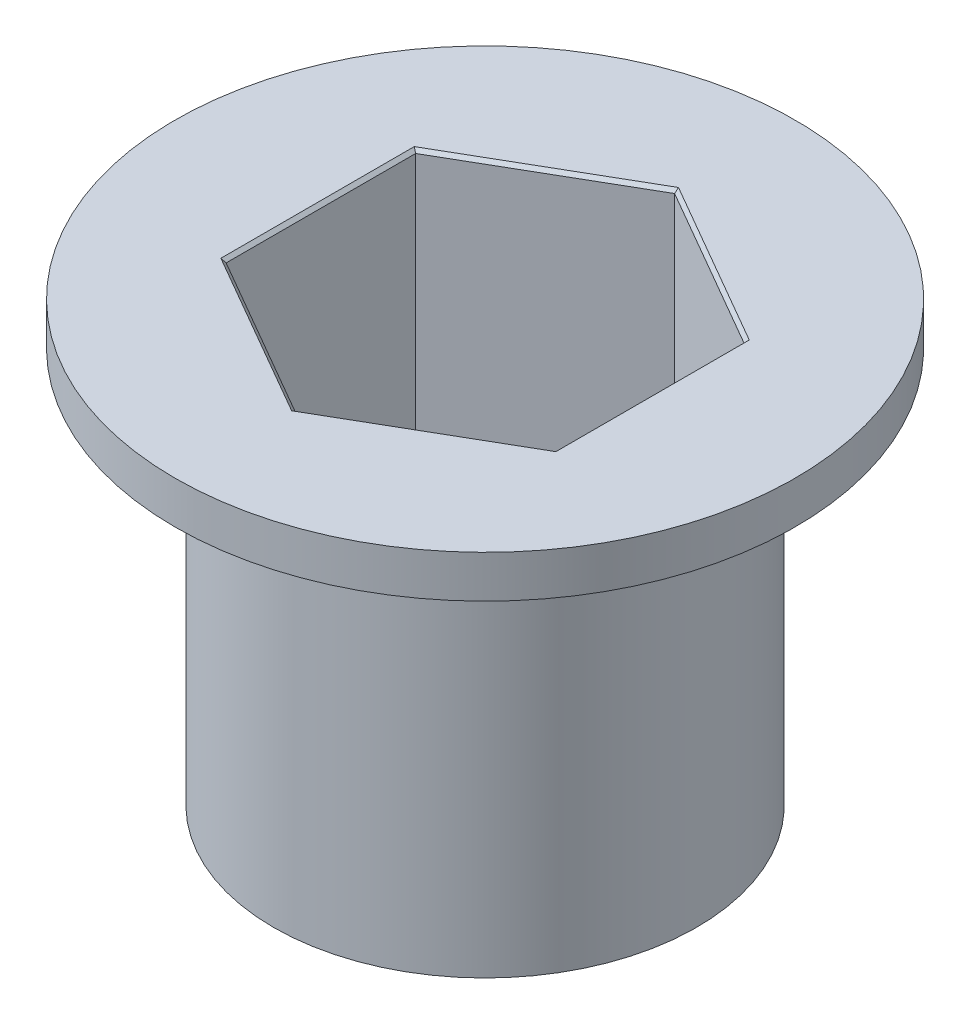
ISO-10303-21;
HEADER;
FILE_DESCRIPTION(('STEP AP214'),'2;1');
FILE_NAME('part.step','',(''),(''),'','','');
FILE_SCHEMA(('AUTOMOTIVE_DESIGN { 1 0 10303 214 1 1 1 1 }'));
ENDSEC;
DATA;
#1=APPLICATION_CONTEXT('core data for automotive mechanical design processes');
#2=APPLICATION_PROTOCOL_DEFINITION('international standard','automotive_design',2000,#1);
#3=PRODUCT_CONTEXT('',#1,'mechanical');
#4=PRODUCT('Part','Part','',(#3));
#5=PRODUCT_RELATED_PRODUCT_CATEGORY('part','',(#4));
#6=PRODUCT_DEFINITION_FORMATION('','',#4);
#7=PRODUCT_DEFINITION_CONTEXT('part definition',#1,'design');
#8=PRODUCT_DEFINITION('design','',#6,#7);
#9=PRODUCT_DEFINITION_SHAPE('','',#8);
#10=(LENGTH_UNIT() NAMED_UNIT(*) SI_UNIT(.MILLI.,.METRE.));
#11=(NAMED_UNIT(*) PLANE_ANGLE_UNIT() SI_UNIT($,.RADIAN.));
#12=(NAMED_UNIT(*) SI_UNIT($,.STERADIAN.) SOLID_ANGLE_UNIT());
#13=UNCERTAINTY_MEASURE_WITH_UNIT(LENGTH_MEASURE(1.E-05),#10,'distance_accuracy_value','');
#14=(GEOMETRIC_REPRESENTATION_CONTEXT(3) GLOBAL_UNCERTAINTY_ASSIGNED_CONTEXT((#13)) GLOBAL_UNIT_ASSIGNED_CONTEXT((#10,
#11,#12)) REPRESENTATION_CONTEXT('',''));
#15=CARTESIAN_POINT('',(0.,0.,0.));
#16=DIRECTION('',(0.,0.,1.));
#17=DIRECTION('',(1.,0.,0.));
#18=AXIS2_PLACEMENT_3D('',#15,#16,#17);
#19=CARTESIAN_POINT('',(0.,0.,0.));
#20=DIRECTION('',(0.,1.,0.));
#21=DIRECTION('',(0.,0.,1.));
#22=AXIS2_PLACEMENT_3D('',#19,#20,#21);
#23=PLANE('',#22);
#24=DIRECTION('',(-0.866025403784439,0.,-0.5));
#25=VECTOR('',#24,1.);
#26=CARTESIAN_POINT('',(0.0499999999999953,0.,-5.77638942130289));
#27=LINE('',#26,#25);
#28=CARTESIAN_POINT('',(5.02749998099999,0.,-2.90262846738119));
#29=VERTEX_POINT('',#28);
#30=CARTESIAN_POINT('',(0.,0.,-5.80525693476237));
#31=VERTEX_POINT('',#30);
#32=EDGE_CURVE('E225',#29,#31,#27,.T.);
#33=ORIENTED_EDGE('',*,*,#32,.T.);
#34=DIRECTION('',(-0.866025403784439,0.,0.5));
#35=VECTOR('',#34,1.);
#36=CARTESIAN_POINT('',(-4.977499981,0.,-2.93149598084066));
#37=LINE('',#36,#35);
#38=CARTESIAN_POINT('',(-5.02749998099999,0.,-2.90262846738118));
#39=VERTEX_POINT('',#38);
#40=EDGE_CURVE('E129',#31,#39,#37,.T.);
#41=ORIENTED_EDGE('',*,*,#40,.T.);
#42=DIRECTION('',(0.,0.,1.));
#43=VECTOR('',#42,1.);
#44=CARTESIAN_POINT('',(-5.02749998099999,0.,2.84489344046223));
#45=LINE('',#44,#43);
#46=CARTESIAN_POINT('',(-5.02749998099999,0.,2.90262846738119));
#47=VERTEX_POINT('',#46);
#48=EDGE_CURVE('E123',#39,#47,#45,.T.);
#49=ORIENTED_EDGE('',*,*,#48,.T.);
#50=DIRECTION('',(0.866025403784439,0.,0.5));
#51=VECTOR('',#50,1.);
#52=CARTESIAN_POINT('',(-0.0499999999999958,0.,5.77638942130289));
#53=LINE('',#52,#51);
#54=CARTESIAN_POINT('',(0.,0.,5.80525693476237));
#55=VERTEX_POINT('',#54);
#56=EDGE_CURVE('E126',#47,#55,#53,.T.);
#57=ORIENTED_EDGE('',*,*,#56,.T.);
#58=DIRECTION('',(0.866025403784439,0.,-0.5));
#59=VECTOR('',#58,1.);
#60=CARTESIAN_POINT('',(4.977499981,0.,2.93149598084066));
#61=LINE('',#60,#59);
#62=CARTESIAN_POINT('',(5.02749998099999,0.,2.90262846738119));
#63=VERTEX_POINT('',#62);
#64=EDGE_CURVE('E133',#55,#63,#61,.T.);
#65=ORIENTED_EDGE('',*,*,#64,.T.);
#66=DIRECTION('',(0.,0.,-1.));
#67=VECTOR('',#66,1.);
#68=CARTESIAN_POINT('',(5.02749998099999,0.,-2.84489344046223));
#69=LINE('',#68,#67);
#70=EDGE_CURVE('E227',#63,#29,#69,.T.);
#71=ORIENTED_EDGE('',*,*,#70,.T.);
#72=EDGE_LOOP('',(#33,#41,#49,#57,#65,#71));
#73=FACE_BOUND('',#72,.T.);
#74=CARTESIAN_POINT('',(0.,0.,0.));
#75=DIRECTION('',(0.,1.,0.));
#76=DIRECTION('',(0.,0.,1.));
#77=AXIS2_PLACEMENT_3D('',#74,#75,#76);
#78=CIRCLE('',#77,6.35);
#79=CARTESIAN_POINT('',(0.,0.,6.35));
#80=VERTEX_POINT('',#79);
#81=EDGE_CURVE('E230',#80,#80,#78,.T.);
#82=ORIENTED_EDGE('',*,*,#81,.F.);
#83=EDGE_LOOP('',(#82));
#84=FACE_BOUND('',#83,.T.);
#85=ADVANCED_FACE('F33',(#73,#84),#23,.F.);
#86=CARTESIAN_POINT('',(0.,11.8872,0.));
#87=DIRECTION('',(0.,-1.,0.));
#88=DIRECTION('',(0.,0.,-1.));
#89=AXIS2_PLACEMENT_3D('',#86,#87,#88);
#90=CYLINDRICAL_SURFACE('',#89,6.35);
#91=CARTESIAN_POINT('',(0.,11.8872,0.));
#92=DIRECTION('',(0.,1.,0.));
#93=DIRECTION('',(0.,0.,1.));
#94=AXIS2_PLACEMENT_3D('',#91,#92,#93);
#95=CIRCLE('',#94,6.35);
#96=CARTESIAN_POINT('',(0.,11.8872,6.35));
#97=VERTEX_POINT('',#96);
#98=EDGE_CURVE('E144',#97,#97,#95,.T.);
#99=ORIENTED_EDGE('',*,*,#98,.F.);
#100=EDGE_LOOP('',(#99));
#101=FACE_BOUND('',#100,.T.);
#102=ORIENTED_EDGE('',*,*,#81,.T.);
#103=EDGE_LOOP('',(#102));
#104=FACE_BOUND('',#103,.T.);
#105=ADVANCED_FACE('F269',(#101,#104),#90,.T.);
#106=CARTESIAN_POINT('',(4.927499981,11.8872,-2.84489344046223));
#107=DIRECTION('',(-0.5,0.,0.866025403784439));
#108=DIRECTION('',(0.866025403784439,0.,0.5));
#109=AXIS2_PLACEMENT_3D('',#106,#107,#108);
#110=PLANE('',#109);
#111=DIRECTION('',(0.,-1.,0.));
#112=VECTOR('',#111,1.);
#113=CARTESIAN_POINT('',(4.927499981,11.8872,-2.84489344046223));
#114=LINE('',#113,#112);
#115=CARTESIAN_POINT('',(4.927499981,13.0572,-2.84489344046223));
#116=VERTEX_POINT('',#115);
#117=CARTESIAN_POINT('',(4.927499981,0.0999999999999959,-2.84489344046223));
#118=VERTEX_POINT('',#117);
#119=EDGE_CURVE('E245',#116,#118,#114,.T.);
#120=ORIENTED_EDGE('',*,*,#119,.F.);
#121=DIRECTION('',(-0.866025403784439,0.,-0.5));
#122=VECTOR('',#121,1.);
#123=CARTESIAN_POINT('',(4.927499981,13.0572,-2.84489344046223));
#124=LINE('',#123,#122);
#125=CARTESIAN_POINT('',(0.,13.0572,-5.68978688092445));
#126=VERTEX_POINT('',#125);
#127=EDGE_CURVE('E56',#116,#126,#124,.T.);
#128=ORIENTED_EDGE('',*,*,#127,.T.);
#129=DIRECTION('',(0.,-1.,0.));
#130=VECTOR('',#129,1.);
#131=CARTESIAN_POINT('',(0.,11.8872,-5.68978688092445));
#132=LINE('',#131,#130);
#133=CARTESIAN_POINT('',(0.,0.0999999999999959,-5.68978688092445));
#134=VERTEX_POINT('',#133);
#135=EDGE_CURVE('E233',#126,#134,#132,.T.);
#136=ORIENTED_EDGE('',*,*,#135,.T.);
#137=DIRECTION('',(0.866025403784439,0.,0.5));
#138=VECTOR('',#137,1.);
#139=CARTESIAN_POINT('',(4.927499981,0.0999999999999958,-2.84489344046223));
#140=LINE('',#139,#138);
#141=EDGE_CURVE('E218',#134,#118,#140,.T.);
#142=ORIENTED_EDGE('',*,*,#141,.T.);
#143=EDGE_LOOP('',(#120,#128,#136,#142));
#144=FACE_BOUND('',#143,.T.);
#145=ADVANCED_FACE('F272',(#144),#110,.T.);
#146=CARTESIAN_POINT('',(0.,11.8872,-5.68978688092445));
#147=DIRECTION('',(0.5,0.,0.866025403784438));
#148=DIRECTION('',(0.866025403784439,0.,-0.5));
#149=AXIS2_PLACEMENT_3D('',#146,#147,#148);
#150=PLANE('',#149);
#151=ORIENTED_EDGE('',*,*,#135,.F.);
#152=DIRECTION('',(-0.866025403784439,0.,0.5));
#153=VECTOR('',#152,1.);
#154=CARTESIAN_POINT('',(0.,13.0572,-5.68978688092445));
#155=LINE('',#154,#153);
#156=CARTESIAN_POINT('',(-4.927499981,13.0572,-2.84489344046223));
#157=VERTEX_POINT('',#156);
#158=EDGE_CURVE('E11',#126,#157,#155,.T.);
#159=ORIENTED_EDGE('',*,*,#158,.T.);
#160=DIRECTION('',(0.,-1.,0.));
#161=VECTOR('',#160,1.);
#162=CARTESIAN_POINT('',(-4.927499981,11.8872,-2.84489344046223));
#163=LINE('',#162,#161);
#164=CARTESIAN_POINT('',(-4.927499981,0.0999999999999959,-2.84489344046223));
#165=VERTEX_POINT('',#164);
#166=EDGE_CURVE('E237',#157,#165,#163,.T.);
#167=ORIENTED_EDGE('',*,*,#166,.T.);
#168=DIRECTION('',(0.866025403784439,0.,-0.5));
#169=VECTOR('',#168,1.);
#170=CARTESIAN_POINT('',(0.,0.0999999999999959,-5.68978688092445));
#171=LINE('',#170,#169);
#172=EDGE_CURVE('E221',#165,#134,#171,.T.);
#173=ORIENTED_EDGE('',*,*,#172,.T.);
#174=EDGE_LOOP('',(#151,#159,#167,#173));
#175=FACE_BOUND('',#174,.T.);
#176=ADVANCED_FACE('F349',(#175),#150,.T.);
#177=CARTESIAN_POINT('',(-4.927499981,11.8872,-2.84489344046223));
#178=DIRECTION('',(1.,0.,0.));
#179=DIRECTION('',(0.,0.,-1.));
#180=AXIS2_PLACEMENT_3D('',#177,#178,#179);
#181=PLANE('',#180);
#182=ORIENTED_EDGE('',*,*,#166,.F.);
#183=DIRECTION('',(0.,0.,1.));
#184=VECTOR('',#183,1.);
#185=CARTESIAN_POINT('',(-4.927499981,13.0572,-2.84489344046223));
#186=LINE('',#185,#184);
#187=CARTESIAN_POINT('',(-4.927499981,13.0572,2.84489344046223));
#188=VERTEX_POINT('',#187);
#189=EDGE_CURVE('E42',#157,#188,#186,.T.);
#190=ORIENTED_EDGE('',*,*,#189,.T.);
#191=DIRECTION('',(0.,-1.,0.));
#192=VECTOR('',#191,1.);
#193=CARTESIAN_POINT('',(-4.927499981,11.8872,2.84489344046223));
#194=LINE('',#193,#192);
#195=CARTESIAN_POINT('',(-4.927499981,0.0999999999999959,2.84489344046223));
#196=VERTEX_POINT('',#195);
#197=EDGE_CURVE('E239',#188,#196,#194,.T.);
#198=ORIENTED_EDGE('',*,*,#197,.T.);
#199=DIRECTION('',(0.,0.,-1.));
#200=VECTOR('',#199,1.);
#201=CARTESIAN_POINT('',(-4.927499981,0.0999999999999959,-2.84489344046223));
#202=LINE('',#201,#200);
#203=EDGE_CURVE('E148',#196,#165,#202,.T.);
#204=ORIENTED_EDGE('',*,*,#203,.T.);
#205=EDGE_LOOP('',(#182,#190,#198,#204));
#206=FACE_BOUND('',#205,.T.);
#207=ADVANCED_FACE('F334',(#206),#181,.T.);
#208=CARTESIAN_POINT('',(-4.927499981,11.8872,2.84489344046223));
#209=DIRECTION('',(0.5,0.,-0.866025403784439));
#210=DIRECTION('',(-0.866025403784439,0.,-0.5));
#211=AXIS2_PLACEMENT_3D('',#208,#209,#210);
#212=PLANE('',#211);
#213=ORIENTED_EDGE('',*,*,#197,.F.);
#214=DIRECTION('',(0.866025403784439,0.,0.5));
#215=VECTOR('',#214,1.);
#216=CARTESIAN_POINT('',(-4.927499981,13.0572,2.84489344046223));
#217=LINE('',#216,#215);
#218=CARTESIAN_POINT('',(0.,13.0572,5.68978688092445));
#219=VERTEX_POINT('',#218);
#220=EDGE_CURVE('E164',#188,#219,#217,.T.);
#221=ORIENTED_EDGE('',*,*,#220,.T.);
#222=DIRECTION('',(0.,-1.,0.));
#223=VECTOR('',#222,1.);
#224=CARTESIAN_POINT('',(0.,11.8872,5.68978688092445));
#225=LINE('',#224,#223);
#226=CARTESIAN_POINT('',(0.,0.0999999999999959,5.68978688092445));
#227=VERTEX_POINT('',#226);
#228=EDGE_CURVE('E241',#219,#227,#225,.T.);
#229=ORIENTED_EDGE('',*,*,#228,.T.);
#230=DIRECTION('',(-0.866025403784439,0.,-0.5));
#231=VECTOR('',#230,1.);
#232=CARTESIAN_POINT('',(-4.927499981,0.0999999999999959,2.84489344046223));
#233=LINE('',#232,#231);
#234=EDGE_CURVE('E168',#227,#196,#233,.T.);
#235=ORIENTED_EDGE('',*,*,#234,.T.);
#236=EDGE_LOOP('',(#213,#221,#229,#235));
#237=FACE_BOUND('',#236,.T.);
#238=ADVANCED_FACE('F336',(#237),#212,.T.);
#239=CARTESIAN_POINT('',(0.,11.8872,5.68978688092445));
#240=DIRECTION('',(-0.5,0.,-0.866025403784439));
#241=DIRECTION('',(-0.866025403784439,0.,0.5));
#242=AXIS2_PLACEMENT_3D('',#239,#240,#241);
#243=PLANE('',#242);
#244=ORIENTED_EDGE('',*,*,#228,.F.);
#245=DIRECTION('',(0.866025403784439,0.,-0.5));
#246=VECTOR('',#245,1.);
#247=CARTESIAN_POINT('',(0.,13.0572,5.68978688092445));
#248=LINE('',#247,#246);
#249=CARTESIAN_POINT('',(4.927499981,13.0572,2.84489344046223));
#250=VERTEX_POINT('',#249);
#251=EDGE_CURVE('E181',#219,#250,#248,.T.);
#252=ORIENTED_EDGE('',*,*,#251,.T.);
#253=DIRECTION('',(0.,-1.,0.));
#254=VECTOR('',#253,1.);
#255=CARTESIAN_POINT('',(4.927499981,11.8872,2.84489344046223));
#256=LINE('',#255,#254);
#257=CARTESIAN_POINT('',(4.927499981,0.0999999999999959,2.84489344046223));
#258=VERTEX_POINT('',#257);
#259=EDGE_CURVE('E243',#250,#258,#256,.T.);
#260=ORIENTED_EDGE('',*,*,#259,.T.);
#261=DIRECTION('',(-0.866025403784439,0.,0.5));
#262=VECTOR('',#261,1.);
#263=CARTESIAN_POINT('',(0.,0.099999999999996,5.68978688092445));
#264=LINE('',#263,#262);
#265=EDGE_CURVE('E212',#258,#227,#264,.T.);
#266=ORIENTED_EDGE('',*,*,#265,.T.);
#267=EDGE_LOOP('',(#244,#252,#260,#266));
#268=FACE_BOUND('',#267,.T.);
#269=ADVANCED_FACE('F340',(#268),#243,.T.);
#270=CARTESIAN_POINT('',(4.927499981,11.8872,2.84489344046223));
#271=DIRECTION('',(-1.,0.,0.));
#272=DIRECTION('',(0.,0.,1.));
#273=AXIS2_PLACEMENT_3D('',#270,#271,#272);
#274=PLANE('',#273);
#275=ORIENTED_EDGE('',*,*,#259,.F.);
#276=DIRECTION('',(0.,0.,-1.));
#277=VECTOR('',#276,1.);
#278=CARTESIAN_POINT('',(4.927499981,13.0572,2.84489344046223));
#279=LINE('',#278,#277);
#280=EDGE_CURVE('E183',#250,#116,#279,.T.);
#281=ORIENTED_EDGE('',*,*,#280,.T.);
#282=ORIENTED_EDGE('',*,*,#119,.T.);
#283=DIRECTION('',(0.,0.,1.));
#284=VECTOR('',#283,1.);
#285=CARTESIAN_POINT('',(4.927499981,0.0999999999999959,2.84489344046223));
#286=LINE('',#285,#284);
#287=EDGE_CURVE('E215',#118,#258,#286,.T.);
#288=ORIENTED_EDGE('',*,*,#287,.T.);
#289=EDGE_LOOP('',(#275,#281,#282,#288));
#290=FACE_BOUND('',#289,.T.);
#291=ADVANCED_FACE('F265',(#290),#274,.T.);
#292=CARTESIAN_POINT('',(0.,11.8872,0.));
#293=DIRECTION('',(0.,1.,0.));
#294=DIRECTION('',(0.,0.,1.));
#295=AXIS2_PLACEMENT_3D('',#292,#293,#294);
#296=PLANE('',#295);
#297=CARTESIAN_POINT('',(0.,11.8872,0.));
#298=DIRECTION('',(0.,1.,0.));
#299=DIRECTION('',(0.,0.,1.));
#300=AXIS2_PLACEMENT_3D('',#297,#298,#299);
#301=CIRCLE('',#300,9.30855036307802);
#302=CARTESIAN_POINT('',(0.,11.8872,9.30855036307802));
#303=VERTEX_POINT('',#302);
#304=EDGE_CURVE('E163',#303,#303,#301,.T.);
#305=ORIENTED_EDGE('',*,*,#304,.F.);
#306=EDGE_LOOP('',(#305));
#307=FACE_BOUND('',#306,.T.);
#308=ORIENTED_EDGE('',*,*,#98,.T.);
#309=EDGE_LOOP('',(#308));
#310=FACE_BOUND('',#309,.T.);
#311=ADVANCED_FACE('F262',(#307,#310),#296,.F.);
#312=CARTESIAN_POINT('',(0.,13.1572,0.));
#313=DIRECTION('',(0.,1.,0.));
#314=DIRECTION('',(0.,0.,1.));
#315=AXIS2_PLACEMENT_3D('',#312,#313,#314);
#316=PLANE('',#315);
#317=DIRECTION('',(-0.866025403784439,0.,0.5));
#318=VECTOR('',#317,1.);
#319=CARTESIAN_POINT('',(2.5137499905,13.1572,4.35394270107178));
#320=LINE('',#319,#318);
#321=CARTESIAN_POINT('',(5.027499981,13.1572,2.90262846738119));
#322=VERTEX_POINT('',#321);
#323=CARTESIAN_POINT('',(0.,13.1572,5.80525693476238));
#324=VERTEX_POINT('',#323);
#325=EDGE_CURVE('E176',#322,#324,#320,.T.);
#326=ORIENTED_EDGE('',*,*,#325,.T.);
#327=DIRECTION('',(-0.866025403784439,0.,-0.5));
#328=VECTOR('',#327,1.);
#329=CARTESIAN_POINT('',(-2.5137499905,13.1572,4.35394270107178));
#330=LINE('',#329,#328);
#331=CARTESIAN_POINT('',(-5.027499981,13.1572,2.90262846738119));
#332=VERTEX_POINT('',#331);
#333=EDGE_CURVE('E178',#324,#332,#330,.T.);
#334=ORIENTED_EDGE('',*,*,#333,.T.);
#335=DIRECTION('',(0.,0.,-1.));
#336=VECTOR('',#335,1.);
#337=CARTESIAN_POINT('',(-5.027499981,13.1572,0.));
#338=LINE('',#337,#336);
#339=CARTESIAN_POINT('',(-5.027499981,13.1572,-2.90262846738119));
#340=VERTEX_POINT('',#339);
#341=EDGE_CURVE('E170',#332,#340,#338,.T.);
#342=ORIENTED_EDGE('',*,*,#341,.T.);
#343=DIRECTION('',(0.866025403784439,0.,-0.5));
#344=VECTOR('',#343,1.);
#345=CARTESIAN_POINT('',(-2.5137499905,13.1572,-4.35394270107178));
#346=LINE('',#345,#344);
#347=CARTESIAN_POINT('',(0.,13.1572,-5.80525693476238));
#348=VERTEX_POINT('',#347);
#349=EDGE_CURVE('E167',#340,#348,#346,.T.);
#350=ORIENTED_EDGE('',*,*,#349,.T.);
#351=DIRECTION('',(0.866025403784439,0.,0.5));
#352=VECTOR('',#351,1.);
#353=CARTESIAN_POINT('',(2.5137499905,13.1572,-4.35394270107178));
#354=LINE('',#353,#352);
#355=CARTESIAN_POINT('',(5.027499981,13.1572,-2.90262846738119));
#356=VERTEX_POINT('',#355);
#357=EDGE_CURVE('E172',#348,#356,#354,.T.);
#358=ORIENTED_EDGE('',*,*,#357,.T.);
#359=DIRECTION('',(0.,0.,1.));
#360=VECTOR('',#359,1.);
#361=CARTESIAN_POINT('',(5.027499981,13.1572,0.));
#362=LINE('',#361,#360);
#363=EDGE_CURVE('E174',#356,#322,#362,.T.);
#364=ORIENTED_EDGE('',*,*,#363,.T.);
#365=EDGE_LOOP('',(#326,#334,#342,#350,#358,#364));
#366=FACE_BOUND('',#365,.T.);
#367=CARTESIAN_POINT('',(0.,13.1572,0.));
#368=DIRECTION('',(0.,1.,0.));
#369=DIRECTION('',(0.,0.,1.));
#370=AXIS2_PLACEMENT_3D('',#367,#368,#369);
#371=CIRCLE('',#370,9.30855036307802);
#372=CARTESIAN_POINT('',(0.,13.1572,9.30855036307802));
#373=VERTEX_POINT('',#372);
#374=EDGE_CURVE('E247',#373,#373,#371,.T.);
#375=ORIENTED_EDGE('',*,*,#374,.T.);
#376=EDGE_LOOP('',(#375));
#377=FACE_BOUND('',#376,.T.);
#378=ADVANCED_FACE('F253',(#366,#377),#316,.T.);
#379=CARTESIAN_POINT('',(0.,13.1572,0.));
#380=DIRECTION('',(0.,-1.,0.));
#381=DIRECTION('',(0.,0.,-1.));
#382=AXIS2_PLACEMENT_3D('',#379,#380,#381);
#383=CYLINDRICAL_SURFACE('',#382,9.30855036307802);
#384=ORIENTED_EDGE('',*,*,#374,.F.);
#385=EDGE_LOOP('',(#384));
#386=FACE_BOUND('',#385,.T.);
#387=ORIENTED_EDGE('',*,*,#304,.T.);
#388=EDGE_LOOP('',(#387));
#389=FACE_BOUND('',#388,.T.);
#390=ADVANCED_FACE('F255',(#386,#389),#383,.T.);
#391=CARTESIAN_POINT('',(2.5137499905,0.,4.35394270107178));
#392=DIRECTION('',(-0.353553390593278,-0.707106781186539,-0.612372435695802));
#393=DIRECTION('',(-0.866025403784439,0.,0.5));
#394=AXIS2_PLACEMENT_3D('',#391,#392,#393);
#395=PLANE('',#394);
#396=DIRECTION('',(0.,-0.654653670707985,0.755928946018448));
#397=VECTOR('',#396,1.);
#398=CARTESIAN_POINT('',(0.,0.718214283000008,4.97593451551061));
#399=LINE('',#398,#397);
#400=EDGE_CURVE('E143',#227,#55,#399,.T.);
#401=ORIENTED_EDGE('',*,*,#400,.F.);
#402=ORIENTED_EDGE('',*,*,#265,.F.);
#403=DIRECTION('',(0.65465367070797,-0.654653670707986,0.377964473009224));
#404=VECTOR('',#403,1.);
#405=CARTESIAN_POINT('',(4.30928569800001,0.718214283000005,2.48796725775531));
#406=LINE('',#405,#404);
#407=EDGE_CURVE('E160',#63,#258,#406,.F.);
#408=ORIENTED_EDGE('',*,*,#407,.F.);
#409=ORIENTED_EDGE('',*,*,#64,.F.);
#410=EDGE_LOOP('',(#401,#402,#408,#409));
#411=FACE_BOUND('',#410,.T.);
#412=ADVANCED_FACE('F258',(#411),#395,.T.);
#413=CARTESIAN_POINT('',(5.02749998099999,0.,0.));
#414=DIRECTION('',(-0.707106781186557,-0.707106781186538,0.));
#415=DIRECTION('',(0.,0.,1.));
#416=AXIS2_PLACEMENT_3D('',#413,#414,#415);
#417=PLANE('',#416);
#418=ORIENTED_EDGE('',*,*,#407,.T.);
#419=ORIENTED_EDGE('',*,*,#287,.F.);
#420=DIRECTION('',(0.654653670707969,-0.654653670707986,-0.377964473009226));
#421=VECTOR('',#420,1.);
#422=CARTESIAN_POINT('',(4.30928569800001,0.718214282999996,-2.48796725775531));
#423=LINE('',#422,#421);
#424=EDGE_CURVE('E149',#29,#118,#423,.F.);
#425=ORIENTED_EDGE('',*,*,#424,.F.);
#426=ORIENTED_EDGE('',*,*,#70,.F.);
#427=EDGE_LOOP('',(#418,#419,#425,#426));
#428=FACE_BOUND('',#427,.T.);
#429=ADVANCED_FACE('F293',(#428),#417,.T.);
#430=CARTESIAN_POINT('',(-2.5137499905,0.,4.35394270107178));
#431=DIRECTION('',(0.353553390593277,-0.707106781186541,-0.6123724356958));
#432=DIRECTION('',(-0.866025403784439,0.,-0.5));
#433=AXIS2_PLACEMENT_3D('',#430,#431,#432);
#434=PLANE('',#433);
#435=ORIENTED_EDGE('',*,*,#400,.T.);
#436=ORIENTED_EDGE('',*,*,#56,.F.);
#437=DIRECTION('',(0.654653670707968,0.654653670707985,-0.377964473009229));
#438=VECTOR('',#437,1.);
#439=CARTESIAN_POINT('',(-4.309285698,0.718214283000011,2.4879672577553));
#440=LINE('',#439,#438);
#441=EDGE_CURVE('E140',#196,#47,#440,.F.);
#442=ORIENTED_EDGE('',*,*,#441,.F.);
#443=ORIENTED_EDGE('',*,*,#234,.F.);
#444=EDGE_LOOP('',(#435,#436,#442,#443));
#445=FACE_BOUND('',#444,.T.);
#446=ADVANCED_FACE('F138',(#445),#434,.T.);
#447=CARTESIAN_POINT('',(2.5137499905,0.,-4.35394270107178));
#448=DIRECTION('',(-0.353553390593277,-0.70710678118654,0.612372435695801));
#449=DIRECTION('',(0.866025403784439,0.,0.5));
#450=AXIS2_PLACEMENT_3D('',#447,#448,#449);
#451=PLANE('',#450);
#452=ORIENTED_EDGE('',*,*,#424,.T.);
#453=ORIENTED_EDGE('',*,*,#141,.F.);
#454=DIRECTION('',(0.,-0.654653670707985,-0.755928946018447));
#455=VECTOR('',#454,1.);
#456=CARTESIAN_POINT('',(0.,0.718214283000001,-4.97593451551062));
#457=LINE('',#456,#455);
#458=EDGE_CURVE('E150',#31,#134,#457,.F.);
#459=ORIENTED_EDGE('',*,*,#458,.F.);
#460=ORIENTED_EDGE('',*,*,#32,.F.);
#461=EDGE_LOOP('',(#452,#453,#459,#460));
#462=FACE_BOUND('',#461,.T.);
#463=ADVANCED_FACE('F287',(#462),#451,.T.);
#464=CARTESIAN_POINT('',(-5.02749998099999,0.,0.));
#465=DIRECTION('',(0.707106781186557,-0.707106781186538,0.));
#466=DIRECTION('',(0.,0.,-1.));
#467=AXIS2_PLACEMENT_3D('',#464,#465,#466);
#468=PLANE('',#467);
#469=ORIENTED_EDGE('',*,*,#441,.T.);
#470=ORIENTED_EDGE('',*,*,#48,.F.);
#471=DIRECTION('',(0.654653670707969,0.654653670707986,0.377964473009226));
#472=VECTOR('',#471,1.);
#473=CARTESIAN_POINT('',(-4.30928569800002,0.718214282999997,-2.48796725775531));
#474=LINE('',#473,#472);
#475=EDGE_CURVE('E155',#165,#39,#474,.F.);
#476=ORIENTED_EDGE('',*,*,#475,.F.);
#477=ORIENTED_EDGE('',*,*,#203,.F.);
#478=EDGE_LOOP('',(#469,#470,#476,#477));
#479=FACE_BOUND('',#478,.T.);
#480=ADVANCED_FACE('F146',(#479),#468,.T.);
#481=CARTESIAN_POINT('',(-2.5137499905,0.,-4.35394270107178));
#482=DIRECTION('',(0.353553390593278,-0.70710678118654,0.612372435695801));
#483=DIRECTION('',(0.866025403784439,0.,-0.5));
#484=AXIS2_PLACEMENT_3D('',#481,#482,#483);
#485=PLANE('',#484);
#486=ORIENTED_EDGE('',*,*,#458,.T.);
#487=ORIENTED_EDGE('',*,*,#172,.F.);
#488=ORIENTED_EDGE('',*,*,#475,.T.);
#489=ORIENTED_EDGE('',*,*,#40,.F.);
#490=EDGE_LOOP('',(#486,#487,#488,#489));
#491=FACE_BOUND('',#490,.T.);
#492=ADVANCED_FACE('F282',(#491),#485,.T.);
#493=CARTESIAN_POINT('',(4.927499981,13.0572,-2.84489344046223));
#494=DIRECTION('',(0.353553390593276,-0.707106781186544,-0.612372435695798));
#495=DIRECTION('',(-0.866025403784439,0.,-0.5));
#496=AXIS2_PLACEMENT_3D('',#493,#494,#495);
#497=PLANE('',#496);
#498=DIRECTION('',(0.654653670707971,0.654653670707982,-0.377964473009229));
#499=VECTOR('',#498,1.);
#500=CARTESIAN_POINT('',(3.51964284357143,11.6493428625714,-2.0320667431873));
#501=LINE('',#500,#499);
#502=EDGE_CURVE('E196',#356,#116,#501,.F.);
#503=ORIENTED_EDGE('',*,*,#502,.F.);
#504=ORIENTED_EDGE('',*,*,#357,.F.);
#505=DIRECTION('',(0.,0.65465367070798,-0.755928946018452));
#506=VECTOR('',#505,1.);
#507=CARTESIAN_POINT('',(0.,11.6493428625714,-4.0641334863746));
#508=LINE('',#507,#506);
#509=EDGE_CURVE('E37',#126,#348,#508,.T.);
#510=ORIENTED_EDGE('',*,*,#509,.F.);
#511=ORIENTED_EDGE('',*,*,#127,.F.);
#512=EDGE_LOOP('',(#503,#504,#510,#511));
#513=FACE_BOUND('',#512,.T.);
#514=ADVANCED_FACE('F35',(#513),#497,.F.);
#515=CARTESIAN_POINT('',(0.,13.0572,-5.68978688092445));
#516=DIRECTION('',(-0.353553390593274,-0.707106781186547,-0.612372435695795));
#517=DIRECTION('',(-0.866025403784439,0.,0.5));
#518=AXIS2_PLACEMENT_3D('',#515,#516,#517);
#519=PLANE('',#518);
#520=ORIENTED_EDGE('',*,*,#509,.T.);
#521=ORIENTED_EDGE('',*,*,#349,.F.);
#522=DIRECTION('',(0.654653670707969,-0.654653670707981,0.377964473009234));
#523=VECTOR('',#522,1.);
#524=CARTESIAN_POINT('',(-4.927499981,13.0572,-2.84489344046223));
#525=LINE('',#524,#523);
#526=EDGE_CURVE('E194',#157,#340,#525,.F.);
#527=ORIENTED_EDGE('',*,*,#526,.F.);
#528=ORIENTED_EDGE('',*,*,#158,.F.);
#529=EDGE_LOOP('',(#520,#521,#527,#528));
#530=FACE_BOUND('',#529,.T.);
#531=ADVANCED_FACE('F314',(#530),#519,.F.);
#532=CARTESIAN_POINT('',(4.927499981,13.0572,2.84489344046223));
#533=DIRECTION('',(0.707106781186554,-0.707106781186541,0.));
#534=DIRECTION('',(0.,0.,-1.));
#535=AXIS2_PLACEMENT_3D('',#532,#533,#534);
#536=PLANE('',#535);
#537=ORIENTED_EDGE('',*,*,#502,.T.);
#538=ORIENTED_EDGE('',*,*,#280,.F.);
#539=DIRECTION('',(0.654653670707972,0.654653670707983,0.377964473009227));
#540=VECTOR('',#539,1.);
#541=CARTESIAN_POINT('',(3.51964284357146,11.6493428625714,2.03206674318732));
#542=LINE('',#541,#540);
#543=EDGE_CURVE('E191',#322,#250,#542,.F.);
#544=ORIENTED_EDGE('',*,*,#543,.F.);
#545=ORIENTED_EDGE('',*,*,#363,.F.);
#546=EDGE_LOOP('',(#537,#538,#544,#545));
#547=FACE_BOUND('',#546,.T.);
#548=ADVANCED_FACE('F311',(#547),#536,.F.);
#549=CARTESIAN_POINT('',(-4.927499981,13.0572,-2.84489344046223));
#550=DIRECTION('',(-0.707106781186554,-0.707106781186541,0.));
#551=DIRECTION('',(0.,0.,1.));
#552=AXIS2_PLACEMENT_3D('',#549,#550,#551);
#553=PLANE('',#552);
#554=ORIENTED_EDGE('',*,*,#526,.T.);
#555=ORIENTED_EDGE('',*,*,#341,.F.);
#556=DIRECTION('',(0.654653670707972,-0.654653670707984,-0.377964473009225));
#557=VECTOR('',#556,1.);
#558=CARTESIAN_POINT('',(-4.927499981,13.0572,2.84489344046223));
#559=LINE('',#558,#557);
#560=EDGE_CURVE('E189',#188,#332,#559,.F.);
#561=ORIENTED_EDGE('',*,*,#560,.F.);
#562=ORIENTED_EDGE('',*,*,#189,.F.);
#563=EDGE_LOOP('',(#554,#555,#561,#562));
#564=FACE_BOUND('',#563,.T.);
#565=ADVANCED_FACE('F307',(#564),#553,.F.);
#566=CARTESIAN_POINT('',(0.,13.0572,5.68978688092445));
#567=DIRECTION('',(0.353553390593276,-0.707106781186543,0.612372435695798));
#568=DIRECTION('',(0.866025403784439,0.,-0.5));
#569=AXIS2_PLACEMENT_3D('',#566,#567,#568);
#570=PLANE('',#569);
#571=ORIENTED_EDGE('',*,*,#543,.T.);
#572=ORIENTED_EDGE('',*,*,#251,.F.);
#573=DIRECTION('',(0.,0.654653670707983,0.755928946018449));
#574=VECTOR('',#573,1.);
#575=CARTESIAN_POINT('',(0.,11.6493428625714,4.06413348637462));
#576=LINE('',#575,#574);
#577=EDGE_CURVE('E187',#324,#219,#576,.F.);
#578=ORIENTED_EDGE('',*,*,#577,.F.);
#579=ORIENTED_EDGE('',*,*,#325,.F.);
#580=EDGE_LOOP('',(#571,#572,#578,#579));
#581=FACE_BOUND('',#580,.T.);
#582=ADVANCED_FACE('F303',(#581),#570,.F.);
#583=CARTESIAN_POINT('',(-4.927499981,13.0572,2.84489344046223));
#584=DIRECTION('',(-0.353553390593277,-0.707106781186541,0.6123724356958));
#585=DIRECTION('',(0.866025403784439,0.,0.5));
#586=AXIS2_PLACEMENT_3D('',#583,#584,#585);
#587=PLANE('',#586);
#588=ORIENTED_EDGE('',*,*,#560,.T.);
#589=ORIENTED_EDGE('',*,*,#333,.F.);
#590=ORIENTED_EDGE('',*,*,#577,.T.);
#591=ORIENTED_EDGE('',*,*,#220,.F.);
#592=EDGE_LOOP('',(#588,#589,#590,#591));
#593=FACE_BOUND('',#592,.T.);
#594=ADVANCED_FACE('F300',(#593),#587,.F.);
#595=CLOSED_SHELL('',(#85,#105,#145,#176,#207,#238,#269,#291,#311,#378,#390,#412,#429,#446,#463,
#480,#492,#514,#531,#548,#565,#582,#594));
#596=MANIFOLD_SOLID_BREP('B2',#595);
#597=ADVANCED_BREP_SHAPE_REPRESENTATION('',(#18,#596),#14);
#598=SHAPE_DEFINITION_REPRESENTATION(#9,#597);
ENDSEC;
END-ISO-10303-21;
